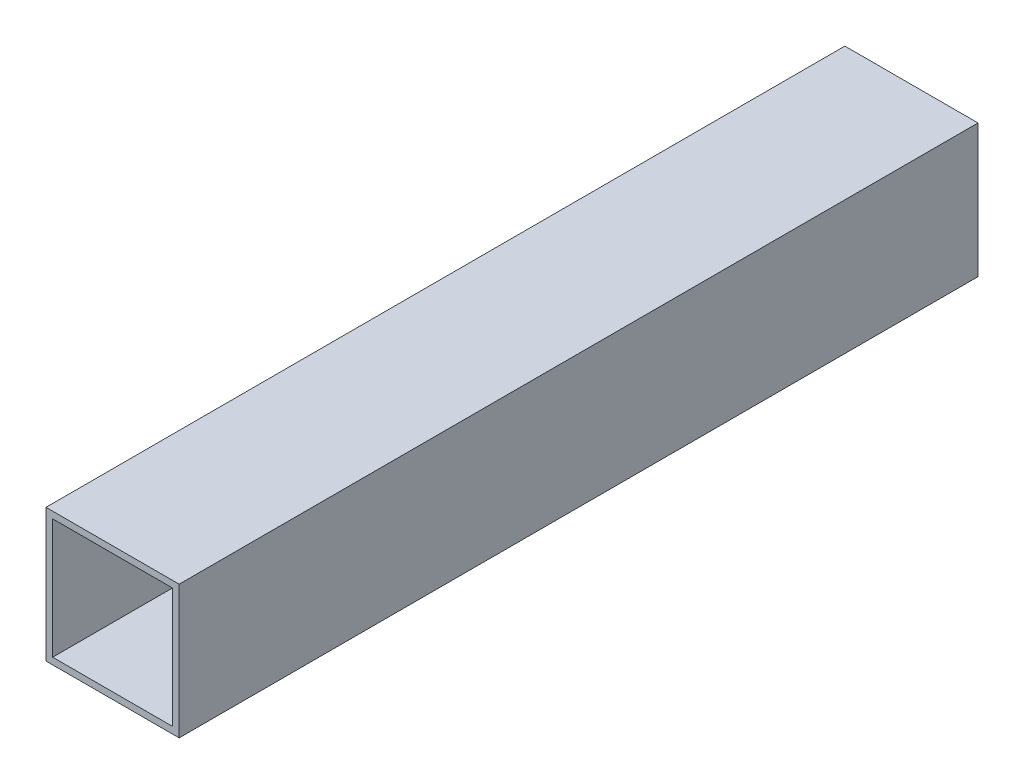
ISO-10303-21;
HEADER;
FILE_DESCRIPTION(('STEP AP214'),'2;1');
FILE_NAME('part.step','',(''),(''),'','','');
FILE_SCHEMA(('AUTOMOTIVE_DESIGN { 1 0 10303 214 1 1 1 1 }'));
ENDSEC;
DATA;
#1=APPLICATION_CONTEXT('core data for automotive mechanical design processes');
#2=APPLICATION_PROTOCOL_DEFINITION('international standard','automotive_design',2000,#1);
#3=PRODUCT_CONTEXT('',#1,'mechanical');
#4=PRODUCT('Part','Part','',(#3));
#5=PRODUCT_RELATED_PRODUCT_CATEGORY('part','',(#4));
#6=PRODUCT_DEFINITION_FORMATION('','',#4);
#7=PRODUCT_DEFINITION_CONTEXT('part definition',#1,'design');
#8=PRODUCT_DEFINITION('design','',#6,#7);
#9=PRODUCT_DEFINITION_SHAPE('','',#8);
#10=(LENGTH_UNIT() NAMED_UNIT(*) SI_UNIT(.MILLI.,.METRE.));
#11=(NAMED_UNIT(*) PLANE_ANGLE_UNIT() SI_UNIT($,.RADIAN.));
#12=(NAMED_UNIT(*) SI_UNIT($,.STERADIAN.) SOLID_ANGLE_UNIT());
#13=UNCERTAINTY_MEASURE_WITH_UNIT(LENGTH_MEASURE(1.E-05),#10,'distance_accuracy_value','');
#14=(GEOMETRIC_REPRESENTATION_CONTEXT(3) GLOBAL_UNCERTAINTY_ASSIGNED_CONTEXT((#13)) GLOBAL_UNIT_ASSIGNED_CONTEXT((#10,
#11,#12)) REPRESENTATION_CONTEXT('',''));
#15=CARTESIAN_POINT('',(0.,0.,0.));
#16=DIRECTION('',(0.,0.,1.));
#17=DIRECTION('',(1.,0.,0.));
#18=AXIS2_PLACEMENT_3D('',#15,#16,#17);
#19=CARTESIAN_POINT('',(0.,0.,60.));
#20=DIRECTION('',(0.,0.,-1.));
#21=DIRECTION('',(-1.,0.,0.));
#22=AXIS2_PLACEMENT_3D('',#19,#20,#21);
#23=PLANE('',#22);
#24=DIRECTION('',(0.,-1.,0.));
#25=VECTOR('',#24,1.);
#26=CARTESIAN_POINT('',(0.,0.,60.));
#27=LINE('',#26,#25);
#28=CARTESIAN_POINT('',(0.,10.,60.));
#29=VERTEX_POINT('',#28);
#30=CARTESIAN_POINT('',(0.,0.,60.));
#31=VERTEX_POINT('',#30);
#32=EDGE_CURVE('E135',#29,#31,#27,.T.);
#33=ORIENTED_EDGE('',*,*,#32,.T.);
#34=DIRECTION('',(1.,0.,0.));
#35=VECTOR('',#34,1.);
#36=CARTESIAN_POINT('',(0.,0.,60.));
#37=LINE('',#36,#35);
#38=CARTESIAN_POINT('',(10.,0.,60.));
#39=VERTEX_POINT('',#38);
#40=EDGE_CURVE('E138',#31,#39,#37,.T.);
#41=ORIENTED_EDGE('',*,*,#40,.T.);
#42=DIRECTION('',(0.,1.,0.));
#43=VECTOR('',#42,1.);
#44=CARTESIAN_POINT('',(10.,0.,60.));
#45=LINE('',#44,#43);
#46=CARTESIAN_POINT('',(10.,10.,60.));
#47=VERTEX_POINT('',#46);
#48=EDGE_CURVE('E141',#39,#47,#45,.T.);
#49=ORIENTED_EDGE('',*,*,#48,.T.);
#50=DIRECTION('',(-1.,0.,0.));
#51=VECTOR('',#50,1.);
#52=CARTESIAN_POINT('',(0.,10.,60.));
#53=LINE('',#52,#51);
#54=EDGE_CURVE('E143',#47,#29,#53,.T.);
#55=ORIENTED_EDGE('',*,*,#54,.T.);
#56=EDGE_LOOP('',(#33,#41,#49,#55));
#57=FACE_BOUND('',#56,.T.);
#58=DIRECTION('',(0.,-1.,0.));
#59=VECTOR('',#58,1.);
#60=CARTESIAN_POINT('',(0.5,9.5,60.));
#61=LINE('',#60,#59);
#62=CARTESIAN_POINT('',(0.5,9.5,60.));
#63=VERTEX_POINT('',#62);
#64=CARTESIAN_POINT('',(0.500000000000001,0.5,60.));
#65=VERTEX_POINT('',#64);
#66=EDGE_CURVE('E99',#63,#65,#61,.T.);
#67=ORIENTED_EDGE('',*,*,#66,.F.);
#68=DIRECTION('',(-1.,0.,0.));
#69=VECTOR('',#68,1.);
#70=CARTESIAN_POINT('',(0.5,9.5,60.));
#71=LINE('',#70,#69);
#72=CARTESIAN_POINT('',(9.5,9.5,60.));
#73=VERTEX_POINT('',#72);
#74=EDGE_CURVE('E121',#73,#63,#71,.T.);
#75=ORIENTED_EDGE('',*,*,#74,.F.);
#76=DIRECTION('',(0.,1.,0.));
#77=VECTOR('',#76,1.);
#78=CARTESIAN_POINT('',(9.5,9.5,60.));
#79=LINE('',#78,#77);
#80=CARTESIAN_POINT('',(9.5,0.5,60.));
#81=VERTEX_POINT('',#80);
#82=EDGE_CURVE('E119',#81,#73,#79,.T.);
#83=ORIENTED_EDGE('',*,*,#82,.F.);
#84=DIRECTION('',(1.,0.,0.));
#85=VECTOR('',#84,1.);
#86=CARTESIAN_POINT('',(0.500000000000001,0.5,60.));
#87=LINE('',#86,#85);
#88=EDGE_CURVE('E107',#65,#81,#87,.T.);
#89=ORIENTED_EDGE('',*,*,#88,.F.);
#90=EDGE_LOOP('',(#67,#75,#83,#89));
#91=FACE_BOUND('',#90,.T.);
#92=ADVANCED_FACE('F34',(#57,#91),#23,.F.);
#93=CARTESIAN_POINT('',(0.,0.,0.));
#94=DIRECTION('',(0.,0.,-1.));
#95=DIRECTION('',(-1.,0.,0.));
#96=AXIS2_PLACEMENT_3D('',#93,#94,#95);
#97=PLANE('',#96);
#98=DIRECTION('',(0.,-1.,0.));
#99=VECTOR('',#98,1.);
#100=CARTESIAN_POINT('',(0.,0.,0.));
#101=LINE('',#100,#99);
#102=CARTESIAN_POINT('',(0.,10.,0.));
#103=VERTEX_POINT('',#102);
#104=CARTESIAN_POINT('',(0.,0.,0.));
#105=VERTEX_POINT('',#104);
#106=EDGE_CURVE('E115',#103,#105,#101,.T.);
#107=ORIENTED_EDGE('',*,*,#106,.F.);
#108=DIRECTION('',(-1.,0.,0.));
#109=VECTOR('',#108,1.);
#110=CARTESIAN_POINT('',(0.,10.,0.));
#111=LINE('',#110,#109);
#112=CARTESIAN_POINT('',(10.,10.,0.));
#113=VERTEX_POINT('',#112);
#114=EDGE_CURVE('E139',#113,#103,#111,.T.);
#115=ORIENTED_EDGE('',*,*,#114,.F.);
#116=DIRECTION('',(0.,1.,0.));
#117=VECTOR('',#116,1.);
#118=CARTESIAN_POINT('',(10.,0.,0.));
#119=LINE('',#118,#117);
#120=CARTESIAN_POINT('',(10.,0.,0.));
#121=VERTEX_POINT('',#120);
#122=EDGE_CURVE('E150',#121,#113,#119,.T.);
#123=ORIENTED_EDGE('',*,*,#122,.F.);
#124=DIRECTION('',(1.,0.,0.));
#125=VECTOR('',#124,1.);
#126=CARTESIAN_POINT('',(0.,0.,0.));
#127=LINE('',#126,#125);
#128=EDGE_CURVE('E148',#105,#121,#127,.T.);
#129=ORIENTED_EDGE('',*,*,#128,.F.);
#130=EDGE_LOOP('',(#107,#115,#123,#129));
#131=FACE_BOUND('',#130,.T.);
#132=DIRECTION('',(-1.,0.,0.));
#133=VECTOR('',#132,1.);
#134=CARTESIAN_POINT('',(0.5,9.5,0.));
#135=LINE('',#134,#133);
#136=CARTESIAN_POINT('',(9.5,9.5,0.));
#137=VERTEX_POINT('',#136);
#138=CARTESIAN_POINT('',(0.5,9.5,0.));
#139=VERTEX_POINT('',#138);
#140=EDGE_CURVE('E108',#137,#139,#135,.T.);
#141=ORIENTED_EDGE('',*,*,#140,.T.);
#142=DIRECTION('',(0.,-1.,0.));
#143=VECTOR('',#142,1.);
#144=CARTESIAN_POINT('',(0.5,9.5,0.));
#145=LINE('',#144,#143);
#146=CARTESIAN_POINT('',(0.500000000000001,0.5,0.));
#147=VERTEX_POINT('',#146);
#148=EDGE_CURVE('E57',#139,#147,#145,.T.);
#149=ORIENTED_EDGE('',*,*,#148,.T.);
#150=DIRECTION('',(1.,0.,0.));
#151=VECTOR('',#150,1.);
#152=CARTESIAN_POINT('',(0.500000000000001,0.5,0.));
#153=LINE('',#152,#151);
#154=CARTESIAN_POINT('',(9.5,0.5,0.));
#155=VERTEX_POINT('',#154);
#156=EDGE_CURVE('E114',#147,#155,#153,.T.);
#157=ORIENTED_EDGE('',*,*,#156,.T.);
#158=DIRECTION('',(0.,1.,0.));
#159=VECTOR('',#158,1.);
#160=CARTESIAN_POINT('',(9.5,9.5,0.));
#161=LINE('',#160,#159);
#162=EDGE_CURVE('E127',#155,#137,#161,.T.);
#163=ORIENTED_EDGE('',*,*,#162,.T.);
#164=EDGE_LOOP('',(#141,#149,#157,#163));
#165=FACE_BOUND('',#164,.T.);
#166=ADVANCED_FACE('F168',(#131,#165),#97,.T.);
#167=CARTESIAN_POINT('',(0.,0.,60.));
#168=DIRECTION('',(1.,0.,0.));
#169=DIRECTION('',(0.,0.,-1.));
#170=AXIS2_PLACEMENT_3D('',#167,#168,#169);
#171=PLANE('',#170);
#172=ORIENTED_EDGE('',*,*,#106,.T.);
#173=DIRECTION('',(0.,0.,-1.));
#174=VECTOR('',#173,1.);
#175=CARTESIAN_POINT('',(0.,0.,60.));
#176=LINE('',#175,#174);
#177=EDGE_CURVE('E11',#31,#105,#176,.T.);
#178=ORIENTED_EDGE('',*,*,#177,.F.);
#179=ORIENTED_EDGE('',*,*,#32,.F.);
#180=DIRECTION('',(0.,0.,-1.));
#181=VECTOR('',#180,1.);
#182=CARTESIAN_POINT('',(0.,10.,60.));
#183=LINE('',#182,#181);
#184=EDGE_CURVE('E145',#29,#103,#183,.T.);
#185=ORIENTED_EDGE('',*,*,#184,.T.);
#186=EDGE_LOOP('',(#172,#178,#179,#185));
#187=FACE_BOUND('',#186,.T.);
#188=ADVANCED_FACE('F36',(#187),#171,.F.);
#189=CARTESIAN_POINT('',(0.,0.,60.));
#190=DIRECTION('',(0.,1.,0.));
#191=DIRECTION('',(0.,0.,1.));
#192=AXIS2_PLACEMENT_3D('',#189,#190,#191);
#193=PLANE('',#192);
#194=ORIENTED_EDGE('',*,*,#128,.T.);
#195=DIRECTION('',(0.,0.,-1.));
#196=VECTOR('',#195,1.);
#197=CARTESIAN_POINT('',(10.,0.,60.));
#198=LINE('',#197,#196);
#199=EDGE_CURVE('E42',#39,#121,#198,.T.);
#200=ORIENTED_EDGE('',*,*,#199,.F.);
#201=ORIENTED_EDGE('',*,*,#40,.F.);
#202=ORIENTED_EDGE('',*,*,#177,.T.);
#203=EDGE_LOOP('',(#194,#200,#201,#202));
#204=FACE_BOUND('',#203,.T.);
#205=ADVANCED_FACE('F178',(#204),#193,.F.);
#206=CARTESIAN_POINT('',(10.,0.,60.));
#207=DIRECTION('',(-1.,0.,0.));
#208=DIRECTION('',(0.,0.,1.));
#209=AXIS2_PLACEMENT_3D('',#206,#207,#208);
#210=PLANE('',#209);
#211=ORIENTED_EDGE('',*,*,#122,.T.);
#212=DIRECTION('',(0.,0.,-1.));
#213=VECTOR('',#212,1.);
#214=CARTESIAN_POINT('',(10.,10.,60.));
#215=LINE('',#214,#213);
#216=EDGE_CURVE('E155',#47,#113,#215,.T.);
#217=ORIENTED_EDGE('',*,*,#216,.F.);
#218=ORIENTED_EDGE('',*,*,#48,.F.);
#219=ORIENTED_EDGE('',*,*,#199,.T.);
#220=EDGE_LOOP('',(#211,#217,#218,#219));
#221=FACE_BOUND('',#220,.T.);
#222=ADVANCED_FACE('F162',(#221),#210,.F.);
#223=CARTESIAN_POINT('',(0.,10.,60.));
#224=DIRECTION('',(0.,-1.,0.));
#225=DIRECTION('',(0.,0.,-1.));
#226=AXIS2_PLACEMENT_3D('',#223,#224,#225);
#227=PLANE('',#226);
#228=ORIENTED_EDGE('',*,*,#114,.T.);
#229=ORIENTED_EDGE('',*,*,#184,.F.);
#230=ORIENTED_EDGE('',*,*,#54,.F.);
#231=ORIENTED_EDGE('',*,*,#216,.T.);
#232=EDGE_LOOP('',(#228,#229,#230,#231));
#233=FACE_BOUND('',#232,.T.);
#234=ADVANCED_FACE('F172',(#233),#227,.F.);
#235=CARTESIAN_POINT('',(0.5,9.5,60.));
#236=DIRECTION('',(1.,0.,0.));
#237=DIRECTION('',(0.,1.,0.));
#238=AXIS2_PLACEMENT_3D('',#235,#236,#237);
#239=PLANE('',#238);
#240=ORIENTED_EDGE('',*,*,#148,.F.);
#241=DIRECTION('',(0.,0.,-1.));
#242=VECTOR('',#241,1.);
#243=CARTESIAN_POINT('',(0.5,9.5,60.));
#244=LINE('',#243,#242);
#245=EDGE_CURVE('E103',#63,#139,#244,.T.);
#246=ORIENTED_EDGE('',*,*,#245,.F.);
#247=ORIENTED_EDGE('',*,*,#66,.T.);
#248=DIRECTION('',(0.,0.,-1.));
#249=VECTOR('',#248,1.);
#250=CARTESIAN_POINT('',(0.500000000000001,0.5,60.));
#251=LINE('',#250,#249);
#252=EDGE_CURVE('E102',#65,#147,#251,.T.);
#253=ORIENTED_EDGE('',*,*,#252,.T.);
#254=EDGE_LOOP('',(#240,#246,#247,#253));
#255=FACE_BOUND('',#254,.T.);
#256=ADVANCED_FACE('F101',(#255),#239,.T.);
#257=CARTESIAN_POINT('',(0.500000000000001,0.5,60.));
#258=DIRECTION('',(0.,1.,0.));
#259=DIRECTION('',(0.,0.,1.));
#260=AXIS2_PLACEMENT_3D('',#257,#258,#259);
#261=PLANE('',#260);
#262=ORIENTED_EDGE('',*,*,#156,.F.);
#263=ORIENTED_EDGE('',*,*,#252,.F.);
#264=ORIENTED_EDGE('',*,*,#88,.T.);
#265=DIRECTION('',(0.,0.,-1.));
#266=VECTOR('',#265,1.);
#267=CARTESIAN_POINT('',(9.5,0.5,60.));
#268=LINE('',#267,#266);
#269=EDGE_CURVE('E116',#81,#155,#268,.T.);
#270=ORIENTED_EDGE('',*,*,#269,.T.);
#271=EDGE_LOOP('',(#262,#263,#264,#270));
#272=FACE_BOUND('',#271,.T.);
#273=ADVANCED_FACE('F111',(#272),#261,.T.);
#274=CARTESIAN_POINT('',(9.5,9.5,60.));
#275=DIRECTION('',(-1.,0.,0.));
#276=DIRECTION('',(0.,-1.,0.));
#277=AXIS2_PLACEMENT_3D('',#274,#275,#276);
#278=PLANE('',#277);
#279=ORIENTED_EDGE('',*,*,#162,.F.);
#280=ORIENTED_EDGE('',*,*,#269,.F.);
#281=ORIENTED_EDGE('',*,*,#82,.T.);
#282=DIRECTION('',(0.,0.,-1.));
#283=VECTOR('',#282,1.);
#284=CARTESIAN_POINT('',(9.5,9.5,60.));
#285=LINE('',#284,#283);
#286=EDGE_CURVE('E49',#73,#137,#285,.T.);
#287=ORIENTED_EDGE('',*,*,#286,.T.);
#288=EDGE_LOOP('',(#279,#280,#281,#287));
#289=FACE_BOUND('',#288,.T.);
#290=ADVANCED_FACE('F201',(#289),#278,.T.);
#291=CARTESIAN_POINT('',(0.5,9.5,60.));
#292=DIRECTION('',(0.,-1.,0.));
#293=DIRECTION('',(0.,0.,-1.));
#294=AXIS2_PLACEMENT_3D('',#291,#292,#293);
#295=PLANE('',#294);
#296=ORIENTED_EDGE('',*,*,#140,.F.);
#297=ORIENTED_EDGE('',*,*,#286,.F.);
#298=ORIENTED_EDGE('',*,*,#74,.T.);
#299=ORIENTED_EDGE('',*,*,#245,.T.);
#300=EDGE_LOOP('',(#296,#297,#298,#299));
#301=FACE_BOUND('',#300,.T.);
#302=ADVANCED_FACE('F205',(#301),#295,.T.);
#303=CLOSED_SHELL('',(#92,#166,#188,#205,#222,#234,#256,#273,#290,#302));
#304=MANIFOLD_SOLID_BREP('B2',#303);
#305=ADVANCED_BREP_SHAPE_REPRESENTATION('',(#18,#304),#14);
#306=SHAPE_DEFINITION_REPRESENTATION(#9,#305);
ENDSEC;
END-ISO-10303-21;
